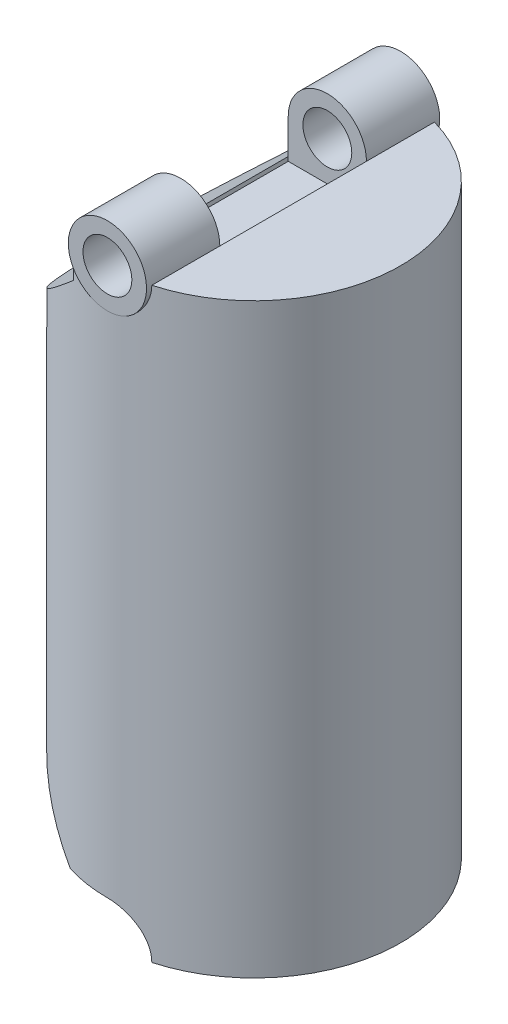
ISO-10303-21;
HEADER;
FILE_DESCRIPTION(('STEP AP214'),'2;1');
FILE_NAME('part.step','',(''),(''),'','','');
FILE_SCHEMA(('AUTOMOTIVE_DESIGN { 1 0 10303 214 1 1 1 1 }'));
ENDSEC;
DATA;
#1=APPLICATION_CONTEXT('core data for automotive mechanical design processes');
#2=APPLICATION_PROTOCOL_DEFINITION('international standard','automotive_design',2000,#1);
#3=PRODUCT_CONTEXT('',#1,'mechanical');
#4=PRODUCT('Part','Part','',(#3));
#5=PRODUCT_RELATED_PRODUCT_CATEGORY('part','',(#4));
#6=PRODUCT_DEFINITION_FORMATION('','',#4);
#7=PRODUCT_DEFINITION_CONTEXT('part definition',#1,'design');
#8=PRODUCT_DEFINITION('design','',#6,#7);
#9=PRODUCT_DEFINITION_SHAPE('','',#8);
#10=(LENGTH_UNIT() NAMED_UNIT(*) SI_UNIT(.MILLI.,.METRE.));
#11=(NAMED_UNIT(*) PLANE_ANGLE_UNIT() SI_UNIT($,.RADIAN.));
#12=(NAMED_UNIT(*) SI_UNIT($,.STERADIAN.) SOLID_ANGLE_UNIT());
#13=UNCERTAINTY_MEASURE_WITH_UNIT(LENGTH_MEASURE(1.E-05),#10,'distance_accuracy_value','');
#14=(GEOMETRIC_REPRESENTATION_CONTEXT(3) GLOBAL_UNCERTAINTY_ASSIGNED_CONTEXT((#13)) GLOBAL_UNIT_ASSIGNED_CONTEXT((#10,
#11,#12)) REPRESENTATION_CONTEXT('',''));
#15=CARTESIAN_POINT('',(0.,0.,0.));
#16=DIRECTION('',(0.,0.,1.));
#17=DIRECTION('',(1.,0.,0.));
#18=AXIS2_PLACEMENT_3D('',#15,#16,#17);
#19=CARTESIAN_POINT('',(-4.,60.,-15.));
#20=DIRECTION('',(1.,0.,0.));
#21=DIRECTION('',(0.,1.,0.));
#22=AXIS2_PLACEMENT_3D('',#19,#20,#21);
#23=PLANE('',#22);
#24=DIRECTION('',(0.,0.,1.));
#25=VECTOR('',#24,1.);
#26=CARTESIAN_POINT('',(-4.,56.4329402576219,-15.));
#27=LINE('',#26,#25);
#28=CARTESIAN_POINT('',(-4.,56.4329402576219,-14.456832294801));
#29=VERTEX_POINT('',#28);
#30=CARTESIAN_POINT('',(-4.,56.4329402576219,-7.5));
#31=VERTEX_POINT('',#30);
#32=EDGE_CURVE('E179',#29,#31,#27,.T.);
#33=ORIENTED_EDGE('',*,*,#32,.T.);
#34=DIRECTION('',(0.,-1.,0.));
#35=VECTOR('',#34,1.);
#36=CARTESIAN_POINT('',(-4.,60.,-7.5));
#37=LINE('',#36,#35);
#38=CARTESIAN_POINT('',(-4.,60.,-7.5));
#39=VERTEX_POINT('',#38);
#40=EDGE_CURVE('E174',#39,#31,#37,.T.);
#41=ORIENTED_EDGE('',*,*,#40,.F.);
#42=DIRECTION('',(0.,0.,1.));
#43=VECTOR('',#42,1.);
#44=CARTESIAN_POINT('',(-4.,60.,-15.));
#45=LINE('',#44,#43);
#46=CARTESIAN_POINT('',(-4.,60.,-14.456832294801));
#47=VERTEX_POINT('',#46);
#48=EDGE_CURVE('E255',#47,#39,#45,.T.);
#49=ORIENTED_EDGE('',*,*,#48,.F.);
#50=DIRECTION('',(0.,-1.,0.));
#51=VECTOR('',#50,1.);
#52=CARTESIAN_POINT('',(-4.,60.,-14.456832294801));
#53=LINE('',#52,#51);
#54=EDGE_CURVE('E182',#29,#47,#53,.F.);
#55=ORIENTED_EDGE('',*,*,#54,.F.);
#56=EDGE_LOOP('',(#33,#41,#49,#55));
#57=FACE_BOUND('',#56,.T.);
#58=ADVANCED_FACE('F39',(#57),#23,.F.);
#59=DIRECTION('',(0.,1.,0.));
#60=VECTOR('',#59,1.);
#61=CARTESIAN_POINT('',(-4.,60.,7.5));
#62=LINE('',#61,#60);
#63=CARTESIAN_POINT('',(-4.,56.4329402576219,7.5));
#64=VERTEX_POINT('',#63);
#65=CARTESIAN_POINT('',(-4.,60.,7.5));
#66=VERTEX_POINT('',#65);
#67=EDGE_CURVE('E180',#64,#66,#62,.T.);
#68=ORIENTED_EDGE('',*,*,#67,.F.);
#69=CARTESIAN_POINT('',(-4.,56.4329402576219,14.456832294801));
#70=VERTEX_POINT('',#69);
#71=EDGE_CURVE('E177',#64,#70,#27,.T.);
#72=ORIENTED_EDGE('',*,*,#71,.T.);
#73=DIRECTION('',(0.,-1.,0.));
#74=VECTOR('',#73,1.);
#75=CARTESIAN_POINT('',(-4.,60.,14.456832294801));
#76=LINE('',#75,#74);
#77=CARTESIAN_POINT('',(-4.,60.,14.456832294801));
#78=VERTEX_POINT('',#77);
#79=EDGE_CURVE('E187',#78,#70,#76,.T.);
#80=ORIENTED_EDGE('',*,*,#79,.F.);
#81=DIRECTION('',(0.,0.,-1.));
#82=VECTOR('',#81,1.);
#83=CARTESIAN_POINT('',(-4.,60.,15.));
#84=LINE('',#83,#82);
#85=EDGE_CURVE('E289',#78,#66,#84,.T.);
#86=ORIENTED_EDGE('',*,*,#85,.T.);
#87=EDGE_LOOP('',(#68,#72,#80,#86));
#88=FACE_BOUND('',#87,.T.);
#89=ADVANCED_FACE('F355',(#88),#23,.F.);
#90=CARTESIAN_POINT('',(0.,60.,-7.5));
#91=DIRECTION('',(0.,0.,1.));
#92=DIRECTION('',(1.,0.,0.));
#93=AXIS2_PLACEMENT_3D('',#90,#91,#92);
#94=CYLINDRICAL_SURFACE('',#93,4.);
#95=DIRECTION('',(0.,0.,1.));
#96=VECTOR('',#95,1.);
#97=CARTESIAN_POINT('',(0.,56.,-7.5));
#98=LINE('',#97,#96);
#99=CARTESIAN_POINT('',(0.,56.,-7.5));
#100=VERTEX_POINT('',#99);
#101=CARTESIAN_POINT('',(0.,56.,7.5));
#102=VERTEX_POINT('',#101);
#103=EDGE_CURVE('E146',#100,#102,#98,.T.);
#104=ORIENTED_EDGE('',*,*,#103,.T.);
#105=CARTESIAN_POINT('',(0.,60.,7.5));
#106=DIRECTION('',(0.,0.,1.));
#107=DIRECTION('',(1.,0.,0.));
#108=AXIS2_PLACEMENT_3D('',#105,#106,#107);
#109=CIRCLE('',#108,4.);
#110=CARTESIAN_POINT('',(4.,60.,7.5));
#111=VERTEX_POINT('',#110);
#112=EDGE_CURVE('E163',#102,#111,#109,.T.);
#113=ORIENTED_EDGE('',*,*,#112,.T.);
#114=DIRECTION('',(0.,0.,1.));
#115=VECTOR('',#114,1.);
#116=CARTESIAN_POINT('',(4.,60.,-7.5));
#117=LINE('',#116,#115);
#118=CARTESIAN_POINT('',(4.,60.,-7.5));
#119=VERTEX_POINT('',#118);
#120=EDGE_CURVE('E159',#111,#119,#117,.F.);
#121=ORIENTED_EDGE('',*,*,#120,.T.);
#122=CARTESIAN_POINT('',(0.,60.,-7.5));
#123=DIRECTION('',(0.,0.,1.));
#124=DIRECTION('',(1.,0.,0.));
#125=AXIS2_PLACEMENT_3D('',#122,#123,#124);
#126=CIRCLE('',#125,4.);
#127=EDGE_CURVE('E143',#100,#119,#126,.T.);
#128=ORIENTED_EDGE('',*,*,#127,.F.);
#129=EDGE_LOOP('',(#104,#113,#121,#128));
#130=FACE_BOUND('',#129,.T.);
#131=ADVANCED_FACE('F160',(#130),#94,.F.);
#132=CARTESIAN_POINT('',(0.,60.,-15.));
#133=DIRECTION('',(0.,0.,1.));
#134=DIRECTION('',(1.,0.,0.));
#135=AXIS2_PLACEMENT_3D('',#132,#133,#134);
#136=CYLINDRICAL_SURFACE('',#135,2.5);
#137=CARTESIAN_POINT('',(0.,60.,-15.));
#138=DIRECTION('',(0.,0.,1.));
#139=DIRECTION('',(1.,0.,0.));
#140=AXIS2_PLACEMENT_3D('',#137,#138,#139);
#141=CIRCLE('',#140,2.5);
#142=CARTESIAN_POINT('',(2.5,60.,-15.));
#143=VERTEX_POINT('',#142);
#144=EDGE_CURVE('E234',#143,#143,#141,.T.);
#145=ORIENTED_EDGE('',*,*,#144,.F.);
#146=EDGE_LOOP('',(#145));
#147=FACE_BOUND('',#146,.T.);
#148=CARTESIAN_POINT('',(0.,60.,-7.5));
#149=DIRECTION('',(0.,0.,1.));
#150=DIRECTION('',(1.,0.,0.));
#151=AXIS2_PLACEMENT_3D('',#148,#149,#150);
#152=CIRCLE('',#151,2.5);
#153=CARTESIAN_POINT('',(2.5,60.,-7.5));
#154=VERTEX_POINT('',#153);
#155=EDGE_CURVE('E235',#154,#154,#152,.T.);
#156=ORIENTED_EDGE('',*,*,#155,.T.);
#157=EDGE_LOOP('',(#156));
#158=FACE_BOUND('',#157,.T.);
#159=ADVANCED_FACE('F210',(#147,#158),#136,.F.);
#160=CARTESIAN_POINT('',(0.,0.,-37.5));
#161=DIRECTION('',(0.,0.,1.));
#162=DIRECTION('',(1.,0.,0.));
#163=AXIS2_PLACEMENT_3D('',#160,#161,#162);
#164=CYLINDRICAL_SURFACE('',#163,4.);
#165=DIRECTION('',(0.,0.,1.));
#166=VECTOR('',#165,1.);
#167=CARTESIAN_POINT('',(0.,4.,-15.));
#168=LINE('',#167,#166);
#169=CARTESIAN_POINT('',(0.,4.,-15.));
#170=VERTEX_POINT('',#169);
#171=CARTESIAN_POINT('',(0.,4.,-7.5));
#172=VERTEX_POINT('',#171);
#173=EDGE_CURVE('E169',#170,#172,#168,.T.);
#174=ORIENTED_EDGE('',*,*,#173,.F.);
#175=CARTESIAN_POINT('',(4.,0.,-14.456832294801));
#176=CARTESIAN_POINT('',(4.00001309389174,0.110358243404116,-14.4568189842467));
#177=CARTESIAN_POINT('',(3.99543311151603,0.220708521992894,-14.4580956467717));
#178=CARTESIAN_POINT('',(3.97718874589725,0.440578653966077,-14.4631301353517));
#179=CARTESIAN_POINT('',(3.96352604983924,0.550098657759752,-14.4668875005959));
#180=CARTESIAN_POINT('',(3.92725695741262,0.767301653514035,-14.4767740441058));
#181=CARTESIAN_POINT('',(3.90466984692446,0.874988087848283,-14.482898107258));
#182=CARTESIAN_POINT('',(3.85076543838184,1.08797486035564,-14.4973231400467));
#183=CARTESIAN_POINT('',(3.81944798699437,1.19327515658533,-14.5056241479174));
#184=CARTESIAN_POINT('',(3.71275643853686,1.50446341877534,-14.5334412456827));
#185=CARTESIAN_POINT('',(3.62460332607935,1.70587493354743,-14.5558829598252));
#186=CARTESIAN_POINT('',(3.4169578047582,2.09102075962575,-14.6060171290377));
#187=CARTESIAN_POINT('',(3.29745504324306,2.27474920397244,-14.6337113178035));
#188=CARTESIAN_POINT('',(3.0273032087801,2.62397057692782,-14.6920016406366));
#189=CARTESIAN_POINT('',(2.87601544465618,2.78896184096573,-14.7226489452442));
#190=CARTESIAN_POINT('',(2.54795832924028,3.09155756696164,-14.7829523618628));
#191=CARTESIAN_POINT('',(2.37118484921249,3.22915758286841,-14.8126083123117));
#192=CARTESIAN_POINT('',(1.99367199592156,3.47517213018545,-14.8681604116921));
#193=CARTESIAN_POINT('',(1.79259414843396,3.58308396557832,-14.8939887414057));
#194=CARTESIAN_POINT('',(1.3743557555279,3.76337288896126,-14.9383834129136));
#195=CARTESIAN_POINT('',(1.15719869214847,3.83575764477688,-14.9569513215518));
#196=CARTESIAN_POINT('',(0.718234307369672,3.94130982516927,-14.9843709217852));
#197=CARTESIAN_POINT('',(0.496647293428107,3.97533721289364,-14.9934353394137));
#198=CARTESIAN_POINT('',(0.0507319917605769,4.00591431322299,-15.0015705103632));
#199=CARTESIAN_POINT('',(-0.173595891963457,4.00246948419253,-15.0006427191926));
#200=CARTESIAN_POINT('',(-0.612629502642173,3.95880431363185,-14.9890534931376));
#201=CARTESIAN_POINT('',(-0.827435206418327,3.91951387234369,-14.9786381919443));
#202=CARTESIAN_POINT('',(-1.24728467665105,3.80677484913674,-14.9495347795912));
#203=CARTESIAN_POINT('',(-1.45232797980576,3.73332464784927,-14.9308462762364));
#204=CARTESIAN_POINT('',(-1.84920963545355,3.55364003374718,-14.8869312076945));
#205=CARTESIAN_POINT('',(-2.04089626466617,3.4470866277702,-14.8616414267933));
#206=CARTESIAN_POINT('',(-2.40398441957148,3.20445723103536,-14.8072486052897));
#207=CARTESIAN_POINT('',(-2.57538239000351,3.06837607781686,-14.7781448982353));
#208=CARTESIAN_POINT('',(-2.89854935036781,2.76567202889861,-14.7182294237973));
#209=CARTESIAN_POINT('',(-3.04955722400808,2.5982419921057,-14.6873926412643));
#210=CARTESIAN_POINT('',(-3.32161448391783,2.23995715929082,-14.6282716207252));
#211=CARTESIAN_POINT('',(-3.4426555807802,2.04909590351884,-14.5999880903709));
#212=CARTESIAN_POINT('',(-3.59932937334133,1.74864671663539,-14.5618587427771));
#213=CARTESIAN_POINT('',(-3.64754371945348,1.64571108495902,-14.5498268172621));
#214=CARTESIAN_POINT('',(-3.73509417643326,1.43595367872854,-14.5275984074125));
#215=CARTESIAN_POINT('',(-3.77443385857864,1.32913348753725,-14.5174011851057));
#216=CARTESIAN_POINT('',(-3.843867838105,1.11248058077981,-14.4991713081511));
#217=CARTESIAN_POINT('',(-3.87397173088603,1.00265112180704,-14.4911364080612));
#218=CARTESIAN_POINT('',(-3.92471856960774,0.780724778875048,-14.4774747012191));
#219=CARTESIAN_POINT('',(-3.9453659249532,0.66862897718001,-14.4718467722231));
#220=CARTESIAN_POINT('',(-3.97411378733402,0.463748975282038,-14.4639761334309));
#221=CARTESIAN_POINT('',(-3.98382319960777,0.371203553832668,-14.4613012625133));
#222=CARTESIAN_POINT('',(-3.99676420153356,0.185774646690122,-14.4577275048596));
#223=CARTESIAN_POINT('',(-4.00000603663184,0.0928919295675446,-14.4568258092259));
#224=CARTESIAN_POINT('',(-4.,0.,-14.456832294801));
#225=B_SPLINE_CURVE_WITH_KNOTS('',3,(#175,#176,#177,#178,#179,#180,#181,#182,#183,#184,#185,
#186,#187,#188,#189,#190,#191,#192,#193,#194,#195,#196,#197,#198,#199,#200,#201,#202,#203,#204,
#205,#206,#207,#208,#209,#210,#211,#212,#213,#214,#215,#216,#217,#218,#219,#220,#221,#222,#223,
#224),.UNSPECIFIED.,.F.,.F.,(4,2,2,2,2,2,2,2,2,2,2,2,2,2,2,2,2,2,2,2,2,2,2,2,4),(0.,
0.330958670878052,0.661855880768518,0.992041890688583,1.32223370010825,1.98190700187181,
2.64179842357631,3.3164963753615,3.99130375261119,4.67691814590524,5.36238449759351,
6.03215661862343,6.7018311790669,7.35461236515045,8.00742449996358,8.66673340793703,
9.32615767867957,10.0057598785669,10.6855498604333,11.0281077435251,11.3705275300852,
11.7125903499582,12.0544935096114,12.3335333037377,12.6121307120356),.UNSPECIFIED.);
#226=CARTESIAN_POINT('',(4.,0.,-14.456832294801));
#227=VERTEX_POINT('',#226);
#228=EDGE_CURVE('E194',#227,#170,#225,.T.);
#229=ORIENTED_EDGE('',*,*,#228,.F.);
#230=DIRECTION('',(0.,0.,1.));
#231=VECTOR('',#230,1.);
#232=CARTESIAN_POINT('',(4.,0.,-37.5));
#233=LINE('',#232,#231);
#234=CARTESIAN_POINT('',(4.,0.,-7.5));
#235=VERTEX_POINT('',#234);
#236=EDGE_CURVE('E311',#235,#227,#233,.F.);
#237=ORIENTED_EDGE('',*,*,#236,.F.);
#238=CARTESIAN_POINT('',(0.,0.,-7.5));
#239=DIRECTION('',(0.,0.,1.));
#240=DIRECTION('',(1.,0.,0.));
#241=AXIS2_PLACEMENT_3D('',#238,#239,#240);
#242=CIRCLE('',#241,4.);
#243=EDGE_CURVE('E186',#235,#172,#242,.T.);
#244=ORIENTED_EDGE('',*,*,#243,.T.);
#245=EDGE_LOOP('',(#174,#229,#237,#244));
#246=FACE_BOUND('',#245,.T.);
#247=ADVANCED_FACE('F205',(#246),#164,.F.);
#248=CARTESIAN_POINT('',(0.,60.,0.));
#249=DIRECTION('',(0.,-1.,0.));
#250=DIRECTION('',(0.,0.,-1.));
#251=AXIS2_PLACEMENT_3D('',#248,#249,#250);
#252=CYLINDRICAL_SURFACE('',#251,15.);
#253=CARTESIAN_POINT('',(-4.,60.,14.456832294801));
#254=CARTESIAN_POINT('',(-4.00001309389175,59.8896417565959,14.4568189842467));
#255=CARTESIAN_POINT('',(-3.99543311151604,59.7792914780071,14.4580956467717));
#256=CARTESIAN_POINT('',(-3.97718874589726,59.5594213460339,14.4631301353517));
#257=CARTESIAN_POINT('',(-3.96352604983924,59.4499013422403,14.4668875005959));
#258=CARTESIAN_POINT('',(-3.92725695741263,59.232698346486,14.4767740441058));
#259=CARTESIAN_POINT('',(-3.90466984692446,59.1250119121517,14.482898107258));
#260=CARTESIAN_POINT('',(-3.85076543838185,58.9120251396443,14.4973231400467));
#261=CARTESIAN_POINT('',(-3.81944798699437,58.8067248434147,14.5056241479174));
#262=CARTESIAN_POINT('',(-3.71275643853687,58.4955365812247,14.5334412456827));
#263=CARTESIAN_POINT('',(-3.62460332607936,58.2941250664526,14.5558829598252));
#264=CARTESIAN_POINT('',(-3.4169578047582,57.9089792403742,14.6060171290377));
#265=CARTESIAN_POINT('',(-3.29745504324306,57.7252507960275,14.6337113178035));
#266=CARTESIAN_POINT('',(-3.0273032087801,57.3760294230722,14.6920016406366));
#267=CARTESIAN_POINT('',(-2.87601544465619,57.2110381590343,14.7226489452442));
#268=CARTESIAN_POINT('',(-2.54795832924028,56.9084424330383,14.7829523618628));
#269=CARTESIAN_POINT('',(-2.37118484921249,56.7708424171316,14.8126083123117));
#270=CARTESIAN_POINT('',(-1.99367199592156,56.5248278698145,14.8681604116921));
#271=CARTESIAN_POINT('',(-1.79259414843396,56.4169160344217,14.8939887414057));
#272=CARTESIAN_POINT('',(-1.3743557555279,56.2366271110387,14.9383834129136));
#273=CARTESIAN_POINT('',(-1.15719869214846,56.1642423552231,14.9569513215518));
#274=CARTESIAN_POINT('',(-0.718234307369669,56.0586901748307,14.9843709217852));
#275=CARTESIAN_POINT('',(-0.496647293428103,56.0246627871064,14.9934353394137));
#276=CARTESIAN_POINT('',(-0.0507319917605736,55.994085686777,15.0015705103632));
#277=CARTESIAN_POINT('',(0.17359589196346,55.9975305158075,15.0006427191926));
#278=CARTESIAN_POINT('',(0.612629502642176,56.0411956863681,14.9890534931376));
#279=CARTESIAN_POINT('',(0.82743520641833,56.0804861276563,14.9786381919443));
#280=CARTESIAN_POINT('',(1.24728467665106,56.1932251508632,14.9495347795912));
#281=CARTESIAN_POINT('',(1.45232797980576,56.2666753521507,14.9308462762364));
#282=CARTESIAN_POINT('',(1.84920963545356,56.4463599662528,14.8869312076945));
#283=CARTESIAN_POINT('',(2.04089626466618,56.5529133722298,14.8616414267933));
#284=CARTESIAN_POINT('',(2.40398441957149,56.7955427689646,14.8072486052897));
#285=CARTESIAN_POINT('',(2.57538239000352,56.9316239221831,14.7781448982353));
#286=CARTESIAN_POINT('',(2.89854935036781,57.2343279711014,14.7182294237973));
#287=CARTESIAN_POINT('',(3.04955722400809,57.4017580078943,14.6873926412643));
#288=CARTESIAN_POINT('',(3.32161448391783,57.7600428407092,14.6282716207252));
#289=CARTESIAN_POINT('',(3.44265558078021,57.9509040964812,14.5999880903709));
#290=CARTESIAN_POINT('',(3.59932937334134,58.2513532833646,14.5618587427771));
#291=CARTESIAN_POINT('',(3.64754371945348,58.354288915041,14.5498268172621));
#292=CARTESIAN_POINT('',(3.73509417643327,58.5640463212715,14.5275984074125));
#293=CARTESIAN_POINT('',(3.77443385857864,58.6708665124627,14.5174011851057));
#294=CARTESIAN_POINT('',(3.84386783810501,58.8875194192202,14.4991713081511));
#295=CARTESIAN_POINT('',(3.87397173088604,58.997348878193,14.4911364080612));
#296=CARTESIAN_POINT('',(3.92471856960775,59.219275221125,14.4774747012191));
#297=CARTESIAN_POINT('',(3.9453659249532,59.33137102282,14.4718467722231));
#298=CARTESIAN_POINT('',(3.97411378733403,59.536251024718,14.4639761334309));
#299=CARTESIAN_POINT('',(3.98382319960777,59.6287964461673,14.4613012625133));
#300=CARTESIAN_POINT('',(3.99676420153356,59.8142253533099,14.4577275048596));
#301=CARTESIAN_POINT('',(4.00000603663184,59.9071080704325,14.4568258092259));
#302=CARTESIAN_POINT('',(4.,60.,14.456832294801));
#303=B_SPLINE_CURVE_WITH_KNOTS('',3,(#253,#254,#255,#256,#257,#258,#259,#260,#261,#262,#263,
#264,#265,#266,#267,#268,#269,#270,#271,#272,#273,#274,#275,#276,#277,#278,#279,#280,#281,#282,
#283,#284,#285,#286,#287,#288,#289,#290,#291,#292,#293,#294,#295,#296,#297,#298,#299,#300,#301,
#302),.UNSPECIFIED.,.F.,.F.,(4,2,2,2,2,2,2,2,2,2,2,2,2,2,2,2,2,2,2,2,2,2,2,2,4),(0.,
0.330958670878051,0.661855880768517,0.992041890688581,1.32223370010826,1.98190700187182,
2.64179842357632,3.31649637536151,3.99130375261119,4.67691814590524,5.36238449759352,
6.03215661862344,6.70183117906691,7.35461236515046,8.0074244999636,8.66673340793705,
9.32615767867959,10.005759878567,10.6855498604333,11.0281077435251,11.3705275300852,
11.7125903499582,12.0544935096115,12.3335333037377,12.6121307120356),.UNSPECIFIED.);
#304=CARTESIAN_POINT('',(0.,56.,15.));
#305=VERTEX_POINT('',#304);
#306=EDGE_CURVE('E283',#78,#305,#303,.T.);
#307=ORIENTED_EDGE('',*,*,#306,.F.);
#308=ORIENTED_EDGE('',*,*,#79,.T.);
#309=CARTESIAN_POINT('',(0.,60.,0.));
#310=DIRECTION('',(0.665562072025988,-0.746342500652665,0.));
#311=DIRECTION('',(-0.746342500652665,-0.665562072025988,0.));
#312=AXIS2_PLACEMENT_3D('',#309,#310,#311);
#313=ELLIPSE('',#312,20.0980112842063,15.);
#314=EDGE_CURVE('E313',#70,#29,#313,.T.);
#315=ORIENTED_EDGE('',*,*,#314,.T.);
#316=ORIENTED_EDGE('',*,*,#54,.T.);
#317=CARTESIAN_POINT('',(-4.,60.,-14.456832294801));
#318=CARTESIAN_POINT('',(-4.00001309389175,59.8896417565959,-14.4568189842467));
#319=CARTESIAN_POINT('',(-3.99543311151604,59.7792914780071,-14.4580956467717));
#320=CARTESIAN_POINT('',(-3.97718874589726,59.5594213460339,-14.4631301353517));
#321=CARTESIAN_POINT('',(-3.96352604983924,59.4499013422403,-14.4668875005959));
#322=CARTESIAN_POINT('',(-3.92725695741263,59.232698346486,-14.4767740441058));
#323=CARTESIAN_POINT('',(-3.90466984692446,59.1250119121517,-14.482898107258));
#324=CARTESIAN_POINT('',(-3.85076543838185,58.9120251396444,-14.4973231400467));
#325=CARTESIAN_POINT('',(-3.81944798699437,58.8067248434147,-14.5056241479174));
#326=CARTESIAN_POINT('',(-3.71275643853687,58.4955365812247,-14.5334412456827));
#327=CARTESIAN_POINT('',(-3.62460332607936,58.2941250664526,-14.5558829598252));
#328=CARTESIAN_POINT('',(-3.4169578047582,57.9089792403742,-14.6060171290377));
#329=CARTESIAN_POINT('',(-3.29745504324307,57.7252507960276,-14.6337113178035));
#330=CARTESIAN_POINT('',(-3.0273032087801,57.3760294230722,-14.6920016406366));
#331=CARTESIAN_POINT('',(-2.87601544465619,57.2110381590343,-14.7226489452442));
#332=CARTESIAN_POINT('',(-2.54795832924029,56.9084424330384,-14.7829523618628));
#333=CARTESIAN_POINT('',(-2.37118484921249,56.7708424171316,-14.8126083123117));
#334=CARTESIAN_POINT('',(-1.99367199592156,56.5248278698145,-14.8681604116921));
#335=CARTESIAN_POINT('',(-1.79259414843396,56.4169160344217,-14.8939887414057));
#336=CARTESIAN_POINT('',(-1.37435575552791,56.2366271110387,-14.9383834129136));
#337=CARTESIAN_POINT('',(-1.15719869214847,56.1642423552231,-14.9569513215518));
#338=CARTESIAN_POINT('',(-0.718234307369676,56.0586901748307,-14.9843709217852));
#339=CARTESIAN_POINT('',(-0.496647293428109,56.0246627871064,-14.9934353394137));
#340=CARTESIAN_POINT('',(-0.0507319917605786,55.994085686777,-15.0015705103632));
#341=CARTESIAN_POINT('',(0.173595891963455,55.9975305158075,-15.0006427191926));
#342=CARTESIAN_POINT('',(0.612629502642172,56.0411956863681,-14.9890534931376));
#343=CARTESIAN_POINT('',(0.827435206418326,56.0804861276563,-14.9786381919443));
#344=CARTESIAN_POINT('',(1.24728467665105,56.1932251508632,-14.9495347795912));
#345=CARTESIAN_POINT('',(1.45232797980576,56.2666753521507,-14.9308462762364));
#346=CARTESIAN_POINT('',(1.84920963545355,56.4463599662528,-14.8869312076945));
#347=CARTESIAN_POINT('',(2.04089626466617,56.5529133722298,-14.8616414267933));
#348=CARTESIAN_POINT('',(2.40398441957148,56.7955427689646,-14.8072486052897));
#349=CARTESIAN_POINT('',(2.57538239000351,56.9316239221831,-14.7781448982353));
#350=CARTESIAN_POINT('',(2.89854935036781,57.2343279711014,-14.7182294237973));
#351=CARTESIAN_POINT('',(3.04955722400809,57.4017580078943,-14.6873926412643));
#352=CARTESIAN_POINT('',(3.32161448391783,57.7600428407092,-14.6282716207252));
#353=CARTESIAN_POINT('',(3.44265558078021,57.9509040964811,-14.5999880903709));
#354=CARTESIAN_POINT('',(3.59932937334134,58.2513532833646,-14.5618587427771));
#355=CARTESIAN_POINT('',(3.64754371945348,58.354288915041,-14.5498268172621));
#356=CARTESIAN_POINT('',(3.73509417643327,58.5640463212715,-14.5275984074125));
#357=CARTESIAN_POINT('',(3.77443385857864,58.6708665124627,-14.5174011851057));
#358=CARTESIAN_POINT('',(3.84386783810501,58.8875194192202,-14.4991713081511));
#359=CARTESIAN_POINT('',(3.87397173088604,58.9973488781929,-14.4911364080612));
#360=CARTESIAN_POINT('',(3.92471856960775,59.2192752211249,-14.4774747012191));
#361=CARTESIAN_POINT('',(3.9453659249532,59.33137102282,-14.4718467722231));
#362=CARTESIAN_POINT('',(3.97411378733403,59.536251024718,-14.4639761334309));
#363=CARTESIAN_POINT('',(3.98382319960777,59.6287964461673,-14.4613012625133));
#364=CARTESIAN_POINT('',(3.99676420153356,59.8142253533099,-14.4577275048596));
#365=CARTESIAN_POINT('',(4.00000603663184,59.9071080704325,-14.4568258092259));
#366=CARTESIAN_POINT('',(4.,60.,-14.456832294801));
#367=B_SPLINE_CURVE_WITH_KNOTS('',3,(#317,#318,#319,#320,#321,#322,#323,#324,#325,#326,#327,
#328,#329,#330,#331,#332,#333,#334,#335,#336,#337,#338,#339,#340,#341,#342,#343,#344,#345,#346,
#347,#348,#349,#350,#351,#352,#353,#354,#355,#356,#357,#358,#359,#360,#361,#362,#363,#364,#365,
#366),.UNSPECIFIED.,.F.,.F.,(4,2,2,2,2,2,2,2,2,2,2,2,2,2,2,2,2,2,2,2,2,2,2,2,4),(0.,
0.330958670878051,0.661855880768517,0.992041890688587,1.32223370010826,1.98190700187182,
2.64179842357632,3.31649637536151,3.9913037526112,4.67691814590525,5.36238449759352,
6.03215661862344,6.70183117906691,7.35461236515047,8.0074244999636,8.66673340793705,
9.32615767867959,10.005759878567,10.6855498604333,11.0281077435251,11.3705275300852,
11.7125903499582,12.0544935096115,12.3335333037377,12.6121307120356),.UNSPECIFIED.);
#368=CARTESIAN_POINT('',(0.,56.,-15.));
#369=VERTEX_POINT('',#368);
#370=EDGE_CURVE('E252',#47,#369,#367,.T.);
#371=ORIENTED_EDGE('',*,*,#370,.T.);
#372=CARTESIAN_POINT('',(4.,60.,-14.456832294801));
#373=VERTEX_POINT('',#372);
#374=EDGE_CURVE('E245',#369,#373,#367,.T.);
#375=ORIENTED_EDGE('',*,*,#374,.T.);
#376=CARTESIAN_POINT('',(0.,60.,0.));
#377=DIRECTION('',(0.,1.,0.));
#378=DIRECTION('',(0.,0.,1.));
#379=AXIS2_PLACEMENT_3D('',#376,#377,#378);
#380=CIRCLE('',#379,15.);
#381=CARTESIAN_POINT('',(4.,60.,14.456832294801));
#382=VERTEX_POINT('',#381);
#383=EDGE_CURVE('E291',#382,#373,#380,.T.);
#384=ORIENTED_EDGE('',*,*,#383,.F.);
#385=EDGE_CURVE('E277',#305,#382,#303,.T.);
#386=ORIENTED_EDGE('',*,*,#385,.F.);
#387=EDGE_LOOP('',(#307,#308,#315,#316,#371,#375,#384,#386));
#388=FACE_BOUND('',#387,.T.);
#389=ORIENTED_EDGE('',*,*,#228,.T.);
#390=CARTESIAN_POINT('',(0.,4.,0.));
#391=DIRECTION('',(0.,1.,0.));
#392=DIRECTION('',(0.,0.,1.));
#393=AXIS2_PLACEMENT_3D('',#390,#391,#392);
#394=CIRCLE('',#393,15.);
#395=CARTESIAN_POINT('',(-4.48548697121987,4.,-14.3136440723883));
#396=VERTEX_POINT('',#395);
#397=EDGE_CURVE('E172',#170,#396,#394,.T.);
#398=ORIENTED_EDGE('',*,*,#397,.T.);
#399=CARTESIAN_POINT('',(0.,0.,0.));
#400=DIRECTION('',(-0.665562072025988,-0.746342500652665,0.));
#401=DIRECTION('',(0.746342500652665,-0.665562072025988,0.));
#402=AXIS2_PLACEMENT_3D('',#399,#400,#401);
#403=ELLIPSE('',#402,20.0980112842063,15.);
#404=CARTESIAN_POINT('',(-4.48548697121987,4.,14.3136440723883));
#405=VERTEX_POINT('',#404);
#406=EDGE_CURVE('E48',#405,#396,#403,.T.);
#407=ORIENTED_EDGE('',*,*,#406,.F.);
#408=CARTESIAN_POINT('',(0.,4.,15.));
#409=VERTEX_POINT('',#408);
#410=EDGE_CURVE('E64',#405,#409,#394,.T.);
#411=ORIENTED_EDGE('',*,*,#410,.T.);
#412=CARTESIAN_POINT('',(4.,0.,14.456832294801));
#413=CARTESIAN_POINT('',(4.00001309389174,0.110358243404116,14.4568189842467));
#414=CARTESIAN_POINT('',(3.99543311151603,0.220708521992894,14.4580956467717));
#415=CARTESIAN_POINT('',(3.97718874589725,0.440578653966077,14.4631301353517));
#416=CARTESIAN_POINT('',(3.96352604983924,0.550098657759752,14.4668875005959));
#417=CARTESIAN_POINT('',(3.92725695741262,0.767301653514035,14.4767740441058));
#418=CARTESIAN_POINT('',(3.90466984692446,0.874988087848283,14.482898107258));
#419=CARTESIAN_POINT('',(3.85076543838184,1.08797486035564,14.4973231400467));
#420=CARTESIAN_POINT('',(3.81944798699437,1.19327515658533,14.5056241479174));
#421=CARTESIAN_POINT('',(3.71275643853686,1.50446341877534,14.5334412456827));
#422=CARTESIAN_POINT('',(3.62460332607935,1.70587493354743,14.5558829598252));
#423=CARTESIAN_POINT('',(3.4169578047582,2.09102075962575,14.6060171290377));
#424=CARTESIAN_POINT('',(3.29745504324306,2.27474920397244,14.6337113178035));
#425=CARTESIAN_POINT('',(3.0273032087801,2.62397057692782,14.6920016406366));
#426=CARTESIAN_POINT('',(2.87601544465618,2.78896184096573,14.7226489452442));
#427=CARTESIAN_POINT('',(2.54795832924028,3.09155756696164,14.7829523618628));
#428=CARTESIAN_POINT('',(2.37118484921249,3.22915758286841,14.8126083123117));
#429=CARTESIAN_POINT('',(1.99367199592156,3.47517213018545,14.8681604116921));
#430=CARTESIAN_POINT('',(1.79259414843396,3.58308396557832,14.8939887414057));
#431=CARTESIAN_POINT('',(1.3743557555279,3.76337288896126,14.9383834129136));
#432=CARTESIAN_POINT('',(1.15719869214847,3.83575764477688,14.9569513215518));
#433=CARTESIAN_POINT('',(0.718234307369672,3.94130982516927,14.9843709217852));
#434=CARTESIAN_POINT('',(0.496647293428107,3.97533721289364,14.9934353394137));
#435=CARTESIAN_POINT('',(0.0507319917605769,4.00591431322299,15.0015705103632));
#436=CARTESIAN_POINT('',(-0.173595891963457,4.00246948419253,15.0006427191926));
#437=CARTESIAN_POINT('',(-0.612629502642173,3.95880431363185,14.9890534931376));
#438=CARTESIAN_POINT('',(-0.827435206418327,3.91951387234369,14.9786381919443));
#439=CARTESIAN_POINT('',(-1.24728467665105,3.80677484913674,14.9495347795912));
#440=CARTESIAN_POINT('',(-1.45232797980576,3.73332464784927,14.9308462762364));
#441=CARTESIAN_POINT('',(-1.84920963545355,3.55364003374718,14.8869312076945));
#442=CARTESIAN_POINT('',(-2.04089626466617,3.4470866277702,14.8616414267933));
#443=CARTESIAN_POINT('',(-2.40398441957148,3.20445723103536,14.8072486052897));
#444=CARTESIAN_POINT('',(-2.57538239000351,3.06837607781686,14.7781448982353));
#445=CARTESIAN_POINT('',(-2.89854935036781,2.76567202889861,14.7182294237973));
#446=CARTESIAN_POINT('',(-3.04955722400808,2.5982419921057,14.6873926412643));
#447=CARTESIAN_POINT('',(-3.32161448391783,2.23995715929082,14.6282716207252));
#448=CARTESIAN_POINT('',(-3.4426555807802,2.04909590351884,14.5999880903709));
#449=CARTESIAN_POINT('',(-3.59932937334133,1.74864671663539,14.5618587427771));
#450=CARTESIAN_POINT('',(-3.64754371945348,1.64571108495902,14.5498268172621));
#451=CARTESIAN_POINT('',(-3.73509417643326,1.43595367872854,14.5275984074125));
#452=CARTESIAN_POINT('',(-3.77443385857864,1.32913348753725,14.5174011851057));
#453=CARTESIAN_POINT('',(-3.843867838105,1.11248058077981,14.4991713081511));
#454=CARTESIAN_POINT('',(-3.87397173088603,1.00265112180704,14.4911364080612));
#455=CARTESIAN_POINT('',(-3.92471856960774,0.780724778875048,14.4774747012191));
#456=CARTESIAN_POINT('',(-3.9453659249532,0.66862897718001,14.4718467722231));
#457=CARTESIAN_POINT('',(-3.97411378733402,0.463748975282038,14.4639761334309));
#458=CARTESIAN_POINT('',(-3.98382319960777,0.371203553832668,14.4613012625133));
#459=CARTESIAN_POINT('',(-3.99676420153356,0.185774646690122,14.4577275048596));
#460=CARTESIAN_POINT('',(-4.00000603663184,0.0928919295675446,14.4568258092259));
#461=CARTESIAN_POINT('',(-4.,0.,14.456832294801));
#462=B_SPLINE_CURVE_WITH_KNOTS('',3,(#412,#413,#414,#415,#416,#417,#418,#419,#420,#421,#422,
#423,#424,#425,#426,#427,#428,#429,#430,#431,#432,#433,#434,#435,#436,#437,#438,#439,#440,#441,
#442,#443,#444,#445,#446,#447,#448,#449,#450,#451,#452,#453,#454,#455,#456,#457,#458,#459,#460,
#461),.UNSPECIFIED.,.F.,.F.,(4,2,2,2,2,2,2,2,2,2,2,2,2,2,2,2,2,2,2,2,2,2,2,2,4),(0.,
0.330958670878052,0.661855880768518,0.992041890688583,1.32223370010825,1.98190700187181,
2.64179842357631,3.3164963753615,3.99130375261119,4.67691814590524,5.36238449759351,
6.03215661862343,6.7018311790669,7.35461236515045,8.00742449996358,8.66673340793703,
9.32615767867957,10.0057598785669,10.6855498604333,11.0281077435251,11.3705275300852,
11.7125903499582,12.0544935096114,12.3335333037377,12.6121307120356),.UNSPECIFIED.);
#463=CARTESIAN_POINT('',(4.,0.,14.456832294801));
#464=VERTEX_POINT('',#463);
#465=EDGE_CURVE('E216',#464,#409,#462,.T.);
#466=ORIENTED_EDGE('',*,*,#465,.F.);
#467=CARTESIAN_POINT('',(0.,0.,0.));
#468=DIRECTION('',(0.,1.,0.));
#469=DIRECTION('',(0.,0.,1.));
#470=AXIS2_PLACEMENT_3D('',#467,#468,#469);
#471=CIRCLE('',#470,15.);
#472=EDGE_CURVE('E292',#464,#227,#471,.T.);
#473=ORIENTED_EDGE('',*,*,#472,.T.);
#474=EDGE_LOOP('',(#389,#398,#407,#411,#466,#473));
#475=FACE_BOUND('',#474,.T.);
#476=ADVANCED_FACE('F41',(#388,#475),#252,.T.);
#477=CARTESIAN_POINT('',(0.,0.,-22.5));
#478=DIRECTION('',(0.,0.,1.));
#479=DIRECTION('',(1.,0.,0.));
#480=AXIS2_PLACEMENT_3D('',#477,#478,#479);
#481=CYLINDRICAL_SURFACE('',#480,2.5);
#482=CARTESIAN_POINT('',(0.,0.,7.5));
#483=DIRECTION('',(0.,0.,1.));
#484=DIRECTION('',(1.,0.,0.));
#485=AXIS2_PLACEMENT_3D('',#482,#483,#484);
#486=CIRCLE('',#485,2.5);
#487=CARTESIAN_POINT('',(2.5,0.,7.5));
#488=VERTEX_POINT('',#487);
#489=EDGE_CURVE('E228',#488,#488,#486,.T.);
#490=ORIENTED_EDGE('',*,*,#489,.T.);
#491=EDGE_LOOP('',(#490));
#492=FACE_BOUND('',#491,.T.);
#493=CARTESIAN_POINT('',(0.,0.,-7.5));
#494=DIRECTION('',(0.,0.,1.));
#495=DIRECTION('',(1.,0.,0.));
#496=AXIS2_PLACEMENT_3D('',#493,#494,#495);
#497=CIRCLE('',#496,2.5);
#498=CARTESIAN_POINT('',(2.5,0.,-7.5));
#499=VERTEX_POINT('',#498);
#500=EDGE_CURVE('E306',#499,#499,#497,.T.);
#501=ORIENTED_EDGE('',*,*,#500,.F.);
#502=EDGE_LOOP('',(#501));
#503=FACE_BOUND('',#502,.T.);
#504=ADVANCED_FACE('F220',(#492,#503),#481,.F.);
#505=CARTESIAN_POINT('',(0.,0.,0.));
#506=DIRECTION('',(0.,1.,0.));
#507=DIRECTION('',(0.,0.,1.));
#508=AXIS2_PLACEMENT_3D('',#505,#506,#507);
#509=PLANE('',#508);
#510=DIRECTION('',(0.,0.,-1.));
#511=VECTOR('',#510,1.);
#512=CARTESIAN_POINT('',(4.,0.,7.5));
#513=LINE('',#512,#511);
#514=CARTESIAN_POINT('',(4.,0.,7.5));
#515=VERTEX_POINT('',#514);
#516=EDGE_CURVE('E303',#235,#515,#513,.F.);
#517=ORIENTED_EDGE('',*,*,#516,.F.);
#518=ORIENTED_EDGE('',*,*,#236,.T.);
#519=ORIENTED_EDGE('',*,*,#472,.F.);
#520=DIRECTION('',(0.,0.,-1.));
#521=VECTOR('',#520,1.);
#522=CARTESIAN_POINT('',(4.,0.,37.5));
#523=LINE('',#522,#521);
#524=EDGE_CURVE('E307',#515,#464,#523,.F.);
#525=ORIENTED_EDGE('',*,*,#524,.F.);
#526=EDGE_LOOP('',(#517,#518,#519,#525));
#527=FACE_BOUND('',#526,.T.);
#528=ADVANCED_FACE('F335',(#527),#509,.F.);
#529=CARTESIAN_POINT('',(0.,60.,0.));
#530=DIRECTION('',(0.,1.,0.));
#531=DIRECTION('',(0.,0.,1.));
#532=AXIS2_PLACEMENT_3D('',#529,#530,#531);
#533=PLANE('',#532);
#534=ORIENTED_EDGE('',*,*,#120,.F.);
#535=DIRECTION('',(0.,0.,-1.));
#536=VECTOR('',#535,1.);
#537=CARTESIAN_POINT('',(4.,60.,15.));
#538=LINE('',#537,#536);
#539=EDGE_CURVE('E298',#111,#382,#538,.F.);
#540=ORIENTED_EDGE('',*,*,#539,.T.);
#541=ORIENTED_EDGE('',*,*,#383,.T.);
#542=DIRECTION('',(0.,0.,1.));
#543=VECTOR('',#542,1.);
#544=CARTESIAN_POINT('',(4.,60.,-15.));
#545=LINE('',#544,#543);
#546=EDGE_CURVE('E301',#119,#373,#545,.F.);
#547=ORIENTED_EDGE('',*,*,#546,.F.);
#548=EDGE_LOOP('',(#534,#540,#541,#547));
#549=FACE_BOUND('',#548,.T.);
#550=ADVANCED_FACE('F503',(#549),#533,.T.);
#551=CARTESIAN_POINT('',(0.,60.,7.5));
#552=DIRECTION('',(0.,0.,1.));
#553=DIRECTION('',(1.,0.,0.));
#554=AXIS2_PLACEMENT_3D('',#551,#552,#553);
#555=CIRCLE('',#554,2.5);
#556=CARTESIAN_POINT('',(2.5,60.,7.5));
#557=VERTEX_POINT('',#556);
#558=EDGE_CURVE('E392',#557,#557,#555,.T.);
#559=ORIENTED_EDGE('',*,*,#558,.F.);
#560=EDGE_LOOP('',(#559));
#561=FACE_BOUND('',#560,.T.);
#562=CARTESIAN_POINT('',(0.,60.,15.));
#563=DIRECTION('',(0.,0.,1.));
#564=DIRECTION('',(1.,0.,0.));
#565=AXIS2_PLACEMENT_3D('',#562,#563,#564);
#566=CIRCLE('',#565,2.5);
#567=CARTESIAN_POINT('',(2.5,60.,15.));
#568=VERTEX_POINT('',#567);
#569=EDGE_CURVE('E390',#568,#568,#566,.T.);
#570=ORIENTED_EDGE('',*,*,#569,.T.);
#571=EDGE_LOOP('',(#570));
#572=FACE_BOUND('',#571,.T.);
#573=ADVANCED_FACE('F270',(#561,#572),#136,.F.);
#574=CARTESIAN_POINT('',(0.,60.,15.));
#575=DIRECTION('',(0.,0.,1.));
#576=DIRECTION('',(1.,0.,0.));
#577=AXIS2_PLACEMENT_3D('',#574,#575,#576);
#578=PLANE('',#577);
#579=CARTESIAN_POINT('',(0.,60.,15.));
#580=DIRECTION('',(0.,0.,1.));
#581=DIRECTION('',(1.,0.,0.));
#582=AXIS2_PLACEMENT_3D('',#579,#580,#581);
#583=CIRCLE('',#582,4.);
#584=EDGE_CURVE('E288',#305,#305,#583,.T.);
#585=ORIENTED_EDGE('',*,*,#584,.T.);
#586=EDGE_LOOP('',(#585));
#587=FACE_BOUND('',#586,.T.);
#588=ORIENTED_EDGE('',*,*,#569,.F.);
#589=EDGE_LOOP('',(#588));
#590=FACE_BOUND('',#589,.T.);
#591=ADVANCED_FACE('F264',(#587,#590),#578,.T.);
#592=CARTESIAN_POINT('',(0.,60.,7.5));
#593=DIRECTION('',(0.,0.,1.));
#594=DIRECTION('',(1.,0.,0.));
#595=AXIS2_PLACEMENT_3D('',#592,#593,#594);
#596=PLANE('',#595);
#597=ORIENTED_EDGE('',*,*,#112,.F.);
#598=DIRECTION('',(-1.,0.,0.));
#599=VECTOR('',#598,1.);
#600=CARTESIAN_POINT('',(0.,56.,7.5));
#601=LINE('',#600,#599);
#602=CARTESIAN_POINT('',(-4.,56.,7.5));
#603=VERTEX_POINT('',#602);
#604=EDGE_CURVE('E54',#102,#603,#601,.T.);
#605=ORIENTED_EDGE('',*,*,#604,.T.);
#606=DIRECTION('',(0.,1.,0.));
#607=VECTOR('',#606,1.);
#608=CARTESIAN_POINT('',(-4.,60.,7.5));
#609=LINE('',#608,#607);
#610=EDGE_CURVE('E153',#603,#64,#609,.T.);
#611=ORIENTED_EDGE('',*,*,#610,.T.);
#612=ORIENTED_EDGE('',*,*,#67,.T.);
#613=CARTESIAN_POINT('',(0.,60.,7.5));
#614=DIRECTION('',(0.,0.,1.));
#615=DIRECTION('',(1.,0.,0.));
#616=AXIS2_PLACEMENT_3D('',#613,#614,#615);
#617=CIRCLE('',#616,4.);
#618=EDGE_CURVE('E290',#111,#66,#617,.T.);
#619=ORIENTED_EDGE('',*,*,#618,.F.);
#620=EDGE_LOOP('',(#597,#605,#611,#612,#619));
#621=FACE_BOUND('',#620,.T.);
#622=ORIENTED_EDGE('',*,*,#558,.T.);
#623=EDGE_LOOP('',(#622));
#624=FACE_BOUND('',#623,.T.);
#625=ADVANCED_FACE('F268',(#621,#624),#596,.F.);
#626=CARTESIAN_POINT('',(0.,60.,15.));
#627=DIRECTION('',(0.,0.,-1.));
#628=DIRECTION('',(-1.,0.,0.));
#629=AXIS2_PLACEMENT_3D('',#626,#627,#628);
#630=CYLINDRICAL_SURFACE('',#629,4.);
#631=ORIENTED_EDGE('',*,*,#306,.T.);
#632=ORIENTED_EDGE('',*,*,#584,.F.);
#633=ORIENTED_EDGE('',*,*,#385,.T.);
#634=ORIENTED_EDGE('',*,*,#539,.F.);
#635=ORIENTED_EDGE('',*,*,#618,.T.);
#636=ORIENTED_EDGE('',*,*,#85,.F.);
#637=EDGE_LOOP('',(#631,#632,#633,#634,#635,#636));
#638=FACE_BOUND('',#637,.T.);
#639=ADVANCED_FACE('F256',(#638),#630,.T.);
#640=CARTESIAN_POINT('',(0.,60.,-15.));
#641=DIRECTION('',(0.,0.,1.));
#642=DIRECTION('',(1.,0.,0.));
#643=AXIS2_PLACEMENT_3D('',#640,#641,#642);
#644=CYLINDRICAL_SURFACE('',#643,4.);
#645=CARTESIAN_POINT('',(0.,60.,-15.));
#646=DIRECTION('',(0.,0.,1.));
#647=DIRECTION('',(1.,0.,0.));
#648=AXIS2_PLACEMENT_3D('',#645,#646,#647);
#649=CIRCLE('',#648,4.);
#650=EDGE_CURVE('E239',#369,#369,#649,.T.);
#651=ORIENTED_EDGE('',*,*,#650,.T.);
#652=ORIENTED_EDGE('',*,*,#370,.F.);
#653=ORIENTED_EDGE('',*,*,#48,.T.);
#654=CARTESIAN_POINT('',(0.,60.,-7.5));
#655=DIRECTION('',(0.,0.,1.));
#656=DIRECTION('',(1.,0.,0.));
#657=AXIS2_PLACEMENT_3D('',#654,#655,#656);
#658=CIRCLE('',#657,4.);
#659=EDGE_CURVE('E240',#119,#39,#658,.T.);
#660=ORIENTED_EDGE('',*,*,#659,.F.);
#661=ORIENTED_EDGE('',*,*,#546,.T.);
#662=ORIENTED_EDGE('',*,*,#374,.F.);
#663=EDGE_LOOP('',(#651,#652,#653,#660,#661,#662));
#664=FACE_BOUND('',#663,.T.);
#665=ADVANCED_FACE('F251',(#664),#644,.T.);
#666=CARTESIAN_POINT('',(0.,60.,-15.));
#667=DIRECTION('',(0.,0.,-1.));
#668=DIRECTION('',(1.,0.,0.));
#669=AXIS2_PLACEMENT_3D('',#666,#667,#668);
#670=PLANE('',#669);
#671=ORIENTED_EDGE('',*,*,#650,.F.);
#672=EDGE_LOOP('',(#671));
#673=FACE_BOUND('',#672,.T.);
#674=ORIENTED_EDGE('',*,*,#144,.T.);
#675=EDGE_LOOP('',(#674));
#676=FACE_BOUND('',#675,.T.);
#677=ADVANCED_FACE('F260',(#673,#676),#670,.T.);
#678=CARTESIAN_POINT('',(0.,60.,-7.5));
#679=DIRECTION('',(0.,0.,-1.));
#680=DIRECTION('',(1.,0.,0.));
#681=AXIS2_PLACEMENT_3D('',#678,#679,#680);
#682=PLANE('',#681);
#683=ORIENTED_EDGE('',*,*,#40,.T.);
#684=DIRECTION('',(0.,-1.,0.));
#685=VECTOR('',#684,1.);
#686=CARTESIAN_POINT('',(-4.,60.,-7.5));
#687=LINE('',#686,#685);
#688=CARTESIAN_POINT('',(-4.,56.,-7.5));
#689=VERTEX_POINT('',#688);
#690=EDGE_CURVE('E147',#31,#689,#687,.T.);
#691=ORIENTED_EDGE('',*,*,#690,.T.);
#692=DIRECTION('',(-1.,0.,0.));
#693=VECTOR('',#692,1.);
#694=CARTESIAN_POINT('',(0.,56.,-7.5));
#695=LINE('',#694,#693);
#696=EDGE_CURVE('E137',#100,#689,#695,.T.);
#697=ORIENTED_EDGE('',*,*,#696,.F.);
#698=ORIENTED_EDGE('',*,*,#127,.T.);
#699=ORIENTED_EDGE('',*,*,#659,.T.);
#700=EDGE_LOOP('',(#683,#691,#697,#698,#699));
#701=FACE_BOUND('',#700,.T.);
#702=ORIENTED_EDGE('',*,*,#155,.F.);
#703=EDGE_LOOP('',(#702));
#704=FACE_BOUND('',#703,.T.);
#705=ADVANCED_FACE('F142',(#701,#704),#682,.F.);
#706=CARTESIAN_POINT('',(0.,0.,7.5));
#707=DIRECTION('',(0.,0.,-1.));
#708=DIRECTION('',(-1.,0.,0.));
#709=AXIS2_PLACEMENT_3D('',#706,#707,#708);
#710=CYLINDRICAL_SURFACE('',#709,4.);
#711=CARTESIAN_POINT('',(0.,0.,-7.5));
#712=DIRECTION('',(0.,0.,1.));
#713=DIRECTION('',(1.,0.,0.));
#714=AXIS2_PLACEMENT_3D('',#711,#712,#713);
#715=CIRCLE('',#714,4.);
#716=EDGE_CURVE('E230',#172,#235,#715,.T.);
#717=ORIENTED_EDGE('',*,*,#716,.T.);
#718=ORIENTED_EDGE('',*,*,#516,.T.);
#719=CARTESIAN_POINT('',(0.,0.,7.5));
#720=DIRECTION('',(0.,0.,1.));
#721=DIRECTION('',(1.,0.,0.));
#722=AXIS2_PLACEMENT_3D('',#719,#720,#721);
#723=CIRCLE('',#722,4.);
#724=CARTESIAN_POINT('',(0.,4.,7.5));
#725=VERTEX_POINT('',#724);
#726=EDGE_CURVE('E229',#725,#515,#723,.T.);
#727=ORIENTED_EDGE('',*,*,#726,.F.);
#728=EDGE_CURVE('E175',#172,#725,#168,.T.);
#729=ORIENTED_EDGE('',*,*,#728,.F.);
#730=EDGE_LOOP('',(#717,#718,#727,#729));
#731=FACE_BOUND('',#730,.T.);
#732=ADVANCED_FACE('F332',(#731),#710,.T.);
#733=CARTESIAN_POINT('',(0.,0.,7.5));
#734=DIRECTION('',(0.,0.,1.));
#735=DIRECTION('',(1.,0.,0.));
#736=AXIS2_PLACEMENT_3D('',#733,#734,#735);
#737=PLANE('',#736);
#738=ORIENTED_EDGE('',*,*,#489,.F.);
#739=EDGE_LOOP('',(#738));
#740=FACE_BOUND('',#739,.T.);
#741=CARTESIAN_POINT('',(0.,0.,7.5));
#742=DIRECTION('',(0.,0.,1.));
#743=DIRECTION('',(1.,0.,0.));
#744=AXIS2_PLACEMENT_3D('',#741,#742,#743);
#745=CIRCLE('',#744,4.);
#746=EDGE_CURVE('E198',#515,#725,#745,.T.);
#747=ORIENTED_EDGE('',*,*,#746,.T.);
#748=ORIENTED_EDGE('',*,*,#726,.T.);
#749=EDGE_LOOP('',(#747,#748));
#750=FACE_BOUND('',#749,.T.);
#751=ADVANCED_FACE('F338',(#740,#750),#737,.T.);
#752=CARTESIAN_POINT('',(0.,0.,-7.5));
#753=DIRECTION('',(0.,0.,1.));
#754=DIRECTION('',(1.,0.,0.));
#755=AXIS2_PLACEMENT_3D('',#752,#753,#754);
#756=PLANE('',#755);
#757=ORIENTED_EDGE('',*,*,#500,.T.);
#758=EDGE_LOOP('',(#757));
#759=FACE_BOUND('',#758,.T.);
#760=ORIENTED_EDGE('',*,*,#716,.F.);
#761=ORIENTED_EDGE('',*,*,#243,.F.);
#762=EDGE_LOOP('',(#760,#761));
#763=FACE_BOUND('',#762,.T.);
#764=ADVANCED_FACE('F211',(#759,#763),#756,.F.);
#765=CARTESIAN_POINT('',(0.,0.,37.5));
#766=DIRECTION('',(0.,0.,-1.));
#767=DIRECTION('',(-1.,0.,0.));
#768=AXIS2_PLACEMENT_3D('',#765,#766,#767);
#769=CYLINDRICAL_SURFACE('',#768,4.);
#770=EDGE_CURVE('E161',#725,#409,#168,.T.);
#771=ORIENTED_EDGE('',*,*,#770,.F.);
#772=ORIENTED_EDGE('',*,*,#746,.F.);
#773=ORIENTED_EDGE('',*,*,#524,.T.);
#774=ORIENTED_EDGE('',*,*,#465,.T.);
#775=EDGE_LOOP('',(#771,#772,#773,#774));
#776=FACE_BOUND('',#775,.T.);
#777=ADVANCED_FACE('F213',(#776),#769,.F.);
#778=CARTESIAN_POINT('',(-4.,56.4329402576219,-15.));
#779=DIRECTION('',(0.665562072025988,-0.746342500652665,0.));
#780=DIRECTION('',(0.746342500652665,0.665562072025988,0.));
#781=AXIS2_PLACEMENT_3D('',#778,#779,#780);
#782=PLANE('',#781);
#783=ORIENTED_EDGE('',*,*,#314,.F.);
#784=ORIENTED_EDGE('',*,*,#71,.F.);
#785=EDGE_CURVE('E164',#31,#64,#27,.T.);
#786=ORIENTED_EDGE('',*,*,#785,.F.);
#787=ORIENTED_EDGE('',*,*,#32,.F.);
#788=EDGE_LOOP('',(#783,#784,#786,#787));
#789=FACE_BOUND('',#788,.T.);
#790=ADVANCED_FACE('F209',(#789),#782,.F.);
#791=CARTESIAN_POINT('',(-4.,3.56705974237814,-15.));
#792=DIRECTION('',(-0.665562072025988,-0.746342500652665,0.));
#793=DIRECTION('',(0.746342500652665,-0.665562072025988,0.));
#794=AXIS2_PLACEMENT_3D('',#791,#792,#793);
#795=PLANE('',#794);
#796=DIRECTION('',(0.,0.,-1.));
#797=VECTOR('',#796,1.);
#798=CARTESIAN_POINT('',(-4.48548697121987,4.,-15.));
#799=LINE('',#798,#797);
#800=EDGE_CURVE('E11',#405,#396,#799,.T.);
#801=ORIENTED_EDGE('',*,*,#800,.F.);
#802=ORIENTED_EDGE('',*,*,#406,.T.);
#803=EDGE_LOOP('',(#801,#802));
#804=FACE_BOUND('',#803,.T.);
#805=ADVANCED_FACE('F319',(#804),#795,.T.);
#806=CARTESIAN_POINT('',(0.,4.,-15.));
#807=DIRECTION('',(0.,1.,0.));
#808=DIRECTION('',(0.,0.,1.));
#809=AXIS2_PLACEMENT_3D('',#806,#807,#808);
#810=PLANE('',#809);
#811=ORIENTED_EDGE('',*,*,#173,.T.);
#812=ORIENTED_EDGE('',*,*,#728,.T.);
#813=ORIENTED_EDGE('',*,*,#770,.T.);
#814=ORIENTED_EDGE('',*,*,#410,.F.);
#815=ORIENTED_EDGE('',*,*,#800,.T.);
#816=ORIENTED_EDGE('',*,*,#397,.F.);
#817=EDGE_LOOP('',(#811,#812,#813,#814,#815,#816));
#818=FACE_BOUND('',#817,.T.);
#819=ADVANCED_FACE('F322',(#818),#810,.F.);
#820=CARTESIAN_POINT('',(0.,56.,-7.5));
#821=DIRECTION('',(0.,-1.,0.));
#822=DIRECTION('',(1.,0.,0.));
#823=AXIS2_PLACEMENT_3D('',#820,#821,#822);
#824=PLANE('',#823);
#825=DIRECTION('',(0.,0.,1.));
#826=VECTOR('',#825,1.);
#827=CARTESIAN_POINT('',(-4.,56.,-7.5));
#828=LINE('',#827,#826);
#829=EDGE_CURVE('E382',#689,#603,#828,.T.);
#830=ORIENTED_EDGE('',*,*,#829,.T.);
#831=ORIENTED_EDGE('',*,*,#604,.F.);
#832=ORIENTED_EDGE('',*,*,#103,.F.);
#833=ORIENTED_EDGE('',*,*,#696,.T.);
#834=EDGE_LOOP('',(#830,#831,#832,#833));
#835=FACE_BOUND('',#834,.T.);
#836=ADVANCED_FACE('F155',(#835),#824,.F.);
#837=CARTESIAN_POINT('',(-3.99999999999999,0.,0.));
#838=DIRECTION('',(-1.,0.,0.));
#839=DIRECTION('',(0.,-1.,0.));
#840=AXIS2_PLACEMENT_3D('',#837,#838,#839);
#841=PLANE('',#840);
#842=ORIENTED_EDGE('',*,*,#785,.T.);
#843=ORIENTED_EDGE('',*,*,#610,.F.);
#844=ORIENTED_EDGE('',*,*,#829,.F.);
#845=ORIENTED_EDGE('',*,*,#690,.F.);
#846=EDGE_LOOP('',(#842,#843,#844,#845));
#847=FACE_BOUND('',#846,.T.);
#848=ADVANCED_FACE('F370',(#847),#841,.F.);
#849=CLOSED_SHELL('',(#58,#89,#131,#159,#247,#476,#504,#528,#550,#573,#591,#625,#639,#665,#677,
#705,#732,#751,#764,#777,#790,#805,#819,#836,#848));
#850=MANIFOLD_SOLID_BREP('B2',#849);
#851=ADVANCED_BREP_SHAPE_REPRESENTATION('',(#18,#850),#14);
#852=SHAPE_DEFINITION_REPRESENTATION(#9,#851);
ENDSEC;
END-ISO-10303-21;
